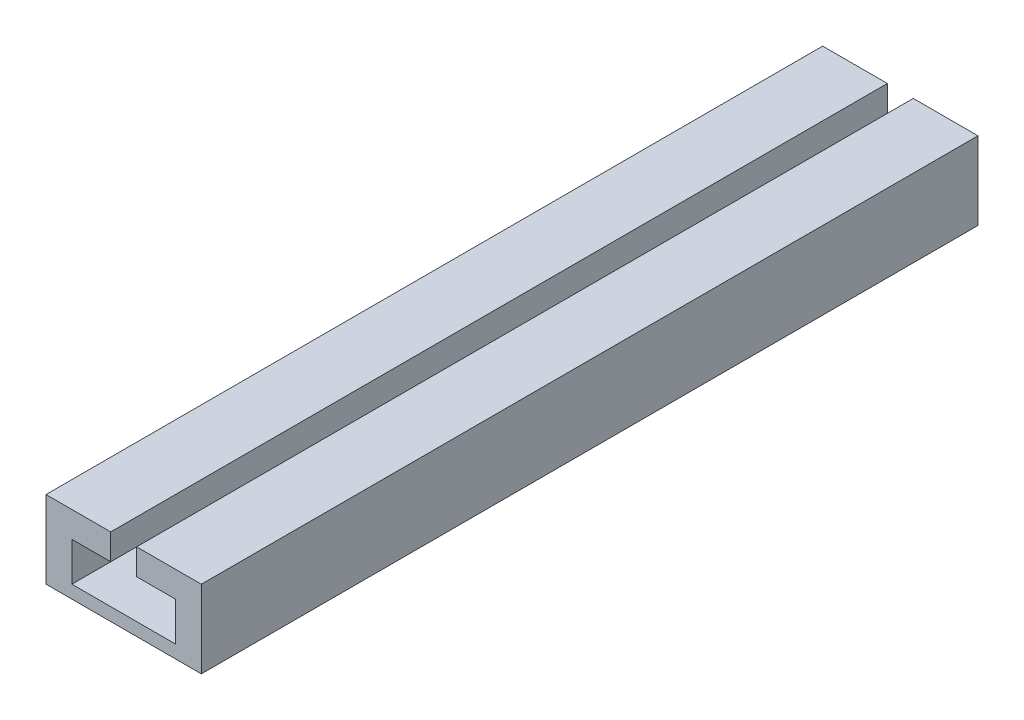
ISO-10303-21;
HEADER;
FILE_DESCRIPTION(('STEP AP214'),'2;1');
FILE_NAME('part.step','',(''),(''),'','','');
FILE_SCHEMA(('AUTOMOTIVE_DESIGN { 1 0 10303 214 1 1 1 1 }'));
ENDSEC;
DATA;
#1=APPLICATION_CONTEXT('core data for automotive mechanical design processes');
#2=APPLICATION_PROTOCOL_DEFINITION('international standard','automotive_design',2000,#1);
#3=PRODUCT_CONTEXT('',#1,'mechanical');
#4=PRODUCT('Part','Part','',(#3));
#5=PRODUCT_RELATED_PRODUCT_CATEGORY('part','',(#4));
#6=PRODUCT_DEFINITION_FORMATION('','',#4);
#7=PRODUCT_DEFINITION_CONTEXT('part definition',#1,'design');
#8=PRODUCT_DEFINITION('design','',#6,#7);
#9=PRODUCT_DEFINITION_SHAPE('','',#8);
#10=(LENGTH_UNIT() NAMED_UNIT(*) SI_UNIT(.MILLI.,.METRE.));
#11=(NAMED_UNIT(*) PLANE_ANGLE_UNIT() SI_UNIT($,.RADIAN.));
#12=(NAMED_UNIT(*) SI_UNIT($,.STERADIAN.) SOLID_ANGLE_UNIT());
#13=UNCERTAINTY_MEASURE_WITH_UNIT(LENGTH_MEASURE(1.E-05),#10,'distance_accuracy_value','');
#14=(GEOMETRIC_REPRESENTATION_CONTEXT(3) GLOBAL_UNCERTAINTY_ASSIGNED_CONTEXT((#13)) GLOBAL_UNIT_ASSIGNED_CONTEXT((#10,
#11,#12)) REPRESENTATION_CONTEXT('',''));
#15=CARTESIAN_POINT('',(0.,0.,0.));
#16=DIRECTION('',(0.,0.,1.));
#17=DIRECTION('',(1.,0.,0.));
#18=AXIS2_PLACEMENT_3D('',#15,#16,#17);
#19=CARTESIAN_POINT('',(0.,0.,30.));
#20=DIRECTION('',(0.,0.,1.));
#21=DIRECTION('',(1.,0.,0.));
#22=AXIS2_PLACEMENT_3D('',#19,#20,#21);
#23=PLANE('',#22);
#24=DIRECTION('',(0.,-1.,0.));
#25=VECTOR('',#24,1.);
#26=CARTESIAN_POINT('',(0.499999999999999,1.5,30.));
#27=LINE('',#26,#25);
#28=CARTESIAN_POINT('',(0.499999999999999,1.5,30.));
#29=VERTEX_POINT('',#28);
#30=CARTESIAN_POINT('',(0.499999999999999,0.5,30.));
#31=VERTEX_POINT('',#30);
#32=EDGE_CURVE('E170',#29,#31,#27,.T.);
#33=ORIENTED_EDGE('',*,*,#32,.T.);
#34=DIRECTION('',(-1.,0.,0.));
#35=VECTOR('',#34,1.);
#36=CARTESIAN_POINT('',(2.,0.5,30.));
#37=LINE('',#36,#35);
#38=CARTESIAN_POINT('',(2.,0.5,30.));
#39=VERTEX_POINT('',#38);
#40=EDGE_CURVE('E47',#39,#31,#37,.T.);
#41=ORIENTED_EDGE('',*,*,#40,.F.);
#42=DIRECTION('',(0.,-1.,0.));
#43=VECTOR('',#42,1.);
#44=CARTESIAN_POINT('',(2.,0.5,30.));
#45=LINE('',#44,#43);
#46=CARTESIAN_POINT('',(2.,-1.,30.));
#47=VERTEX_POINT('',#46);
#48=EDGE_CURVE('E126',#39,#47,#45,.T.);
#49=ORIENTED_EDGE('',*,*,#48,.T.);
#50=DIRECTION('',(-1.,0.,0.));
#51=VECTOR('',#50,1.);
#52=CARTESIAN_POINT('',(2.,-1.,30.));
#53=LINE('',#52,#51);
#54=CARTESIAN_POINT('',(-2.,-1.,30.));
#55=VERTEX_POINT('',#54);
#56=EDGE_CURVE('E136',#47,#55,#53,.T.);
#57=ORIENTED_EDGE('',*,*,#56,.T.);
#58=DIRECTION('',(0.,-1.,0.));
#59=VECTOR('',#58,1.);
#60=CARTESIAN_POINT('',(-2.,0.5,30.));
#61=LINE('',#60,#59);
#62=CARTESIAN_POINT('',(-2.,0.5,30.));
#63=VERTEX_POINT('',#62);
#64=EDGE_CURVE('E140',#63,#55,#61,.T.);
#65=ORIENTED_EDGE('',*,*,#64,.F.);
#66=CARTESIAN_POINT('',(-0.500000000000001,0.5,30.));
#67=VERTEX_POINT('',#66);
#68=EDGE_CURVE('E150',#67,#63,#37,.T.);
#69=ORIENTED_EDGE('',*,*,#68,.F.);
#70=DIRECTION('',(0.,-1.,0.));
#71=VECTOR('',#70,1.);
#72=CARTESIAN_POINT('',(-0.500000000000001,1.5,30.));
#73=LINE('',#72,#71);
#74=CARTESIAN_POINT('',(-0.500000000000001,1.5,30.));
#75=VERTEX_POINT('',#74);
#76=EDGE_CURVE('E167',#75,#67,#73,.T.);
#77=ORIENTED_EDGE('',*,*,#76,.F.);
#78=DIRECTION('',(1.,0.,0.));
#79=VECTOR('',#78,1.);
#80=CARTESIAN_POINT('',(-3.,1.5,30.));
#81=LINE('',#80,#79);
#82=CARTESIAN_POINT('',(-3.,1.5,30.));
#83=VERTEX_POINT('',#82);
#84=EDGE_CURVE('E191',#83,#75,#81,.T.);
#85=ORIENTED_EDGE('',*,*,#84,.F.);
#86=DIRECTION('',(0.,-1.,0.));
#87=VECTOR('',#86,1.);
#88=CARTESIAN_POINT('',(-3.,1.5,30.));
#89=LINE('',#88,#87);
#90=CARTESIAN_POINT('',(-3.,-1.5,30.));
#91=VERTEX_POINT('',#90);
#92=EDGE_CURVE('E181',#83,#91,#89,.T.);
#93=ORIENTED_EDGE('',*,*,#92,.T.);
#94=DIRECTION('',(1.,0.,0.));
#95=VECTOR('',#94,1.);
#96=CARTESIAN_POINT('',(-3.,-1.5,30.));
#97=LINE('',#96,#95);
#98=CARTESIAN_POINT('',(3.,-1.5,30.));
#99=VERTEX_POINT('',#98);
#100=EDGE_CURVE('E184',#91,#99,#97,.T.);
#101=ORIENTED_EDGE('',*,*,#100,.T.);
#102=DIRECTION('',(0.,-1.,0.));
#103=VECTOR('',#102,1.);
#104=CARTESIAN_POINT('',(3.,1.5,30.));
#105=LINE('',#104,#103);
#106=CARTESIAN_POINT('',(3.,1.5,30.));
#107=VERTEX_POINT('',#106);
#108=EDGE_CURVE('E187',#107,#99,#105,.T.);
#109=ORIENTED_EDGE('',*,*,#108,.F.);
#110=EDGE_CURVE('E190',#29,#107,#81,.T.);
#111=ORIENTED_EDGE('',*,*,#110,.F.);
#112=EDGE_LOOP('',(#33,#41,#49,#57,#65,#69,#77,#85,#93,#101,#109,#111));
#113=FACE_BOUND('',#112,.T.);
#114=ADVANCED_FACE('F33',(#113),#23,.T.);
#115=CARTESIAN_POINT('',(0.,0.,0.));
#116=DIRECTION('',(0.,0.,1.));
#117=DIRECTION('',(1.,0.,0.));
#118=AXIS2_PLACEMENT_3D('',#115,#116,#117);
#119=PLANE('',#118);
#120=DIRECTION('',(-1.,0.,0.));
#121=VECTOR('',#120,1.);
#122=CARTESIAN_POINT('',(2.,0.5,0.));
#123=LINE('',#122,#121);
#124=CARTESIAN_POINT('',(2.,0.5,0.));
#125=VERTEX_POINT('',#124);
#126=CARTESIAN_POINT('',(0.499999999999999,0.5,0.));
#127=VERTEX_POINT('',#126);
#128=EDGE_CURVE('E143',#125,#127,#123,.T.);
#129=ORIENTED_EDGE('',*,*,#128,.T.);
#130=DIRECTION('',(0.,-1.,0.));
#131=VECTOR('',#130,1.);
#132=CARTESIAN_POINT('',(0.499999999999999,1.5,0.));
#133=LINE('',#132,#131);
#134=CARTESIAN_POINT('',(0.499999999999999,1.5,0.));
#135=VERTEX_POINT('',#134);
#136=EDGE_CURVE('E171',#135,#127,#133,.T.);
#137=ORIENTED_EDGE('',*,*,#136,.F.);
#138=DIRECTION('',(1.,0.,0.));
#139=VECTOR('',#138,1.);
#140=CARTESIAN_POINT('',(-3.,1.5,0.));
#141=LINE('',#140,#139);
#142=CARTESIAN_POINT('',(3.,1.5,0.));
#143=VERTEX_POINT('',#142);
#144=EDGE_CURVE('E203',#135,#143,#141,.T.);
#145=ORIENTED_EDGE('',*,*,#144,.T.);
#146=DIRECTION('',(0.,-1.,0.));
#147=VECTOR('',#146,1.);
#148=CARTESIAN_POINT('',(3.,1.5,0.));
#149=LINE('',#148,#147);
#150=CARTESIAN_POINT('',(3.,-1.5,0.));
#151=VERTEX_POINT('',#150);
#152=EDGE_CURVE('E200',#143,#151,#149,.T.);
#153=ORIENTED_EDGE('',*,*,#152,.T.);
#154=DIRECTION('',(1.,0.,0.));
#155=VECTOR('',#154,1.);
#156=CARTESIAN_POINT('',(-3.,-1.5,0.));
#157=LINE('',#156,#155);
#158=CARTESIAN_POINT('',(-3.,-1.5,0.));
#159=VERTEX_POINT('',#158);
#160=EDGE_CURVE('E197',#159,#151,#157,.T.);
#161=ORIENTED_EDGE('',*,*,#160,.F.);
#162=DIRECTION('',(0.,-1.,0.));
#163=VECTOR('',#162,1.);
#164=CARTESIAN_POINT('',(-3.,1.5,0.));
#165=LINE('',#164,#163);
#166=CARTESIAN_POINT('',(-3.,1.5,0.));
#167=VERTEX_POINT('',#166);
#168=EDGE_CURVE('E180',#167,#159,#165,.T.);
#169=ORIENTED_EDGE('',*,*,#168,.F.);
#170=CARTESIAN_POINT('',(-0.500000000000001,1.5,0.));
#171=VERTEX_POINT('',#170);
#172=EDGE_CURVE('E185',#167,#171,#141,.T.);
#173=ORIENTED_EDGE('',*,*,#172,.T.);
#174=DIRECTION('',(0.,-1.,0.));
#175=VECTOR('',#174,1.);
#176=CARTESIAN_POINT('',(-0.500000000000001,1.5,0.));
#177=LINE('',#176,#175);
#178=CARTESIAN_POINT('',(-0.500000000000001,0.5,0.));
#179=VERTEX_POINT('',#178);
#180=EDGE_CURVE('E166',#171,#179,#177,.T.);
#181=ORIENTED_EDGE('',*,*,#180,.T.);
#182=CARTESIAN_POINT('',(-2.,0.5,0.));
#183=VERTEX_POINT('',#182);
#184=EDGE_CURVE('E146',#179,#183,#123,.T.);
#185=ORIENTED_EDGE('',*,*,#184,.T.);
#186=DIRECTION('',(0.,-1.,0.));
#187=VECTOR('',#186,1.);
#188=CARTESIAN_POINT('',(-2.,0.5,0.));
#189=LINE('',#188,#187);
#190=CARTESIAN_POINT('',(-2.,-1.,0.));
#191=VERTEX_POINT('',#190);
#192=EDGE_CURVE('E155',#183,#191,#189,.T.);
#193=ORIENTED_EDGE('',*,*,#192,.T.);
#194=DIRECTION('',(-1.,0.,0.));
#195=VECTOR('',#194,1.);
#196=CARTESIAN_POINT('',(2.,-1.,0.));
#197=LINE('',#196,#195);
#198=CARTESIAN_POINT('',(2.,-1.,0.));
#199=VERTEX_POINT('',#198);
#200=EDGE_CURVE('E153',#199,#191,#197,.T.);
#201=ORIENTED_EDGE('',*,*,#200,.F.);
#202=DIRECTION('',(0.,-1.,0.));
#203=VECTOR('',#202,1.);
#204=CARTESIAN_POINT('',(2.,0.5,0.));
#205=LINE('',#204,#203);
#206=EDGE_CURVE('E128',#125,#199,#205,.T.);
#207=ORIENTED_EDGE('',*,*,#206,.F.);
#208=EDGE_LOOP('',(#129,#137,#145,#153,#161,#169,#173,#181,#185,#193,#201,#207));
#209=FACE_BOUND('',#208,.T.);
#210=ADVANCED_FACE('F221',(#209),#119,.F.);
#211=CARTESIAN_POINT('',(-0.500000000000001,1.5,30.));
#212=DIRECTION('',(1.,0.,0.));
#213=DIRECTION('',(0.,1.,0.));
#214=AXIS2_PLACEMENT_3D('',#211,#212,#213);
#215=PLANE('',#214);
#216=ORIENTED_EDGE('',*,*,#76,.T.);
#217=DIRECTION('',(0.,0.,-1.));
#218=VECTOR('',#217,1.);
#219=CARTESIAN_POINT('',(-0.500000000000001,0.5,30.));
#220=LINE('',#219,#218);
#221=EDGE_CURVE('E160',#67,#179,#220,.T.);
#222=ORIENTED_EDGE('',*,*,#221,.T.);
#223=ORIENTED_EDGE('',*,*,#180,.F.);
#224=DIRECTION('',(0.,0.,-1.));
#225=VECTOR('',#224,1.);
#226=CARTESIAN_POINT('',(-0.500000000000001,1.5,30.));
#227=LINE('',#226,#225);
#228=EDGE_CURVE('E177',#75,#171,#227,.T.);
#229=ORIENTED_EDGE('',*,*,#228,.F.);
#230=EDGE_LOOP('',(#216,#222,#223,#229));
#231=FACE_BOUND('',#230,.T.);
#232=ADVANCED_FACE('F227',(#231),#215,.T.);
#233=CARTESIAN_POINT('',(0.499999999999999,1.5,30.));
#234=DIRECTION('',(1.,0.,0.));
#235=DIRECTION('',(0.,1.,0.));
#236=AXIS2_PLACEMENT_3D('',#233,#234,#235);
#237=PLANE('',#236);
#238=DIRECTION('',(0.,0.,-1.));
#239=VECTOR('',#238,1.);
#240=CARTESIAN_POINT('',(0.499999999999999,0.5,30.));
#241=LINE('',#240,#239);
#242=EDGE_CURVE('E11',#31,#127,#241,.T.);
#243=ORIENTED_EDGE('',*,*,#242,.F.);
#244=ORIENTED_EDGE('',*,*,#32,.F.);
#245=DIRECTION('',(0.,0.,-1.));
#246=VECTOR('',#245,1.);
#247=CARTESIAN_POINT('',(0.499999999999999,1.5,30.));
#248=LINE('',#247,#246);
#249=EDGE_CURVE('E55',#29,#135,#248,.T.);
#250=ORIENTED_EDGE('',*,*,#249,.T.);
#251=ORIENTED_EDGE('',*,*,#136,.T.);
#252=EDGE_LOOP('',(#243,#244,#250,#251));
#253=FACE_BOUND('',#252,.T.);
#254=ADVANCED_FACE('F238',(#253),#237,.F.);
#255=CARTESIAN_POINT('',(-3.,1.5,30.));
#256=DIRECTION('',(0.,1.,0.));
#257=DIRECTION('',(0.,0.,1.));
#258=AXIS2_PLACEMENT_3D('',#255,#256,#257);
#259=PLANE('',#258);
#260=ORIENTED_EDGE('',*,*,#84,.T.);
#261=ORIENTED_EDGE('',*,*,#228,.T.);
#262=ORIENTED_EDGE('',*,*,#172,.F.);
#263=DIRECTION('',(0.,0.,-1.));
#264=VECTOR('',#263,1.);
#265=CARTESIAN_POINT('',(-3.,1.5,30.));
#266=LINE('',#265,#264);
#267=EDGE_CURVE('E194',#83,#167,#266,.T.);
#268=ORIENTED_EDGE('',*,*,#267,.F.);
#269=EDGE_LOOP('',(#260,#261,#262,#268));
#270=FACE_BOUND('',#269,.T.);
#271=ADVANCED_FACE('F223',(#270),#259,.T.);
#272=CARTESIAN_POINT('',(-3.,1.5,30.));
#273=DIRECTION('',(1.,0.,0.));
#274=DIRECTION('',(0.,1.,0.));
#275=AXIS2_PLACEMENT_3D('',#272,#273,#274);
#276=PLANE('',#275);
#277=ORIENTED_EDGE('',*,*,#168,.T.);
#278=DIRECTION('',(0.,0.,-1.));
#279=VECTOR('',#278,1.);
#280=CARTESIAN_POINT('',(-3.,-1.5,30.));
#281=LINE('',#280,#279);
#282=EDGE_CURVE('E41',#91,#159,#281,.T.);
#283=ORIENTED_EDGE('',*,*,#282,.F.);
#284=ORIENTED_EDGE('',*,*,#92,.F.);
#285=ORIENTED_EDGE('',*,*,#267,.T.);
#286=EDGE_LOOP('',(#277,#283,#284,#285));
#287=FACE_BOUND('',#286,.T.);
#288=ADVANCED_FACE('F35',(#287),#276,.F.);
#289=CARTESIAN_POINT('',(-3.,-1.5,30.));
#290=DIRECTION('',(0.,1.,0.));
#291=DIRECTION('',(0.,0.,1.));
#292=AXIS2_PLACEMENT_3D('',#289,#290,#291);
#293=PLANE('',#292);
#294=ORIENTED_EDGE('',*,*,#160,.T.);
#295=DIRECTION('',(0.,0.,-1.));
#296=VECTOR('',#295,1.);
#297=CARTESIAN_POINT('',(3.,-1.5,30.));
#298=LINE('',#297,#296);
#299=EDGE_CURVE('E210',#99,#151,#298,.T.);
#300=ORIENTED_EDGE('',*,*,#299,.F.);
#301=ORIENTED_EDGE('',*,*,#100,.F.);
#302=ORIENTED_EDGE('',*,*,#282,.T.);
#303=EDGE_LOOP('',(#294,#300,#301,#302));
#304=FACE_BOUND('',#303,.T.);
#305=ADVANCED_FACE('F214',(#304),#293,.F.);
#306=CARTESIAN_POINT('',(3.,1.5,30.));
#307=DIRECTION('',(1.,0.,0.));
#308=DIRECTION('',(0.,1.,0.));
#309=AXIS2_PLACEMENT_3D('',#306,#307,#308);
#310=PLANE('',#309);
#311=ORIENTED_EDGE('',*,*,#152,.F.);
#312=DIRECTION('',(0.,0.,-1.));
#313=VECTOR('',#312,1.);
#314=CARTESIAN_POINT('',(3.,1.5,30.));
#315=LINE('',#314,#313);
#316=EDGE_CURVE('E207',#107,#143,#315,.T.);
#317=ORIENTED_EDGE('',*,*,#316,.F.);
#318=ORIENTED_EDGE('',*,*,#108,.T.);
#319=ORIENTED_EDGE('',*,*,#299,.T.);
#320=EDGE_LOOP('',(#311,#317,#318,#319));
#321=FACE_BOUND('',#320,.T.);
#322=ADVANCED_FACE('F246',(#321),#310,.T.);
#323=ORIENTED_EDGE('',*,*,#249,.F.);
#324=ORIENTED_EDGE('',*,*,#110,.T.);
#325=ORIENTED_EDGE('',*,*,#316,.T.);
#326=ORIENTED_EDGE('',*,*,#144,.F.);
#327=EDGE_LOOP('',(#323,#324,#325,#326));
#328=FACE_BOUND('',#327,.T.);
#329=ADVANCED_FACE('F243',(#328),#259,.T.);
#330=CARTESIAN_POINT('',(2.,0.5,30.));
#331=DIRECTION('',(0.,-1.,0.));
#332=DIRECTION('',(0.,0.,-1.));
#333=AXIS2_PLACEMENT_3D('',#330,#331,#332);
#334=PLANE('',#333);
#335=ORIENTED_EDGE('',*,*,#242,.T.);
#336=ORIENTED_EDGE('',*,*,#128,.F.);
#337=DIRECTION('',(0.,0.,-1.));
#338=VECTOR('',#337,1.);
#339=CARTESIAN_POINT('',(2.,0.5,30.));
#340=LINE('',#339,#338);
#341=EDGE_CURVE('E158',#39,#125,#340,.T.);
#342=ORIENTED_EDGE('',*,*,#341,.F.);
#343=ORIENTED_EDGE('',*,*,#40,.T.);
#344=EDGE_LOOP('',(#335,#336,#342,#343));
#345=FACE_BOUND('',#344,.T.);
#346=ADVANCED_FACE('F253',(#345),#334,.T.);
#347=CARTESIAN_POINT('',(2.,0.5,30.));
#348=DIRECTION('',(1.,0.,0.));
#349=DIRECTION('',(0.,0.,-1.));
#350=AXIS2_PLACEMENT_3D('',#347,#348,#349);
#351=PLANE('',#350);
#352=ORIENTED_EDGE('',*,*,#206,.T.);
#353=DIRECTION('',(0.,0.,-1.));
#354=VECTOR('',#353,1.);
#355=CARTESIAN_POINT('',(2.,-1.,30.));
#356=LINE('',#355,#354);
#357=EDGE_CURVE('E122',#47,#199,#356,.T.);
#358=ORIENTED_EDGE('',*,*,#357,.F.);
#359=ORIENTED_EDGE('',*,*,#48,.F.);
#360=ORIENTED_EDGE('',*,*,#341,.T.);
#361=EDGE_LOOP('',(#352,#358,#359,#360));
#362=FACE_BOUND('',#361,.T.);
#363=ADVANCED_FACE('F124',(#362),#351,.F.);
#364=ORIENTED_EDGE('',*,*,#68,.T.);
#365=DIRECTION('',(0.,0.,-1.));
#366=VECTOR('',#365,1.);
#367=CARTESIAN_POINT('',(-2.,0.5,30.));
#368=LINE('',#367,#366);
#369=EDGE_CURVE('E161',#63,#183,#368,.T.);
#370=ORIENTED_EDGE('',*,*,#369,.T.);
#371=ORIENTED_EDGE('',*,*,#184,.F.);
#372=ORIENTED_EDGE('',*,*,#221,.F.);
#373=EDGE_LOOP('',(#364,#370,#371,#372));
#374=FACE_BOUND('',#373,.T.);
#375=ADVANCED_FACE('F231',(#374),#334,.T.);
#376=CARTESIAN_POINT('',(-2.,0.5,30.));
#377=DIRECTION('',(1.,0.,0.));
#378=DIRECTION('',(0.,0.,-1.));
#379=AXIS2_PLACEMENT_3D('',#376,#377,#378);
#380=PLANE('',#379);
#381=ORIENTED_EDGE('',*,*,#192,.F.);
#382=ORIENTED_EDGE('',*,*,#369,.F.);
#383=ORIENTED_EDGE('',*,*,#64,.T.);
#384=DIRECTION('',(0.,0.,-1.));
#385=VECTOR('',#384,1.);
#386=CARTESIAN_POINT('',(-2.,-1.,30.));
#387=LINE('',#386,#385);
#388=EDGE_CURVE('E132',#55,#191,#387,.T.);
#389=ORIENTED_EDGE('',*,*,#388,.T.);
#390=EDGE_LOOP('',(#381,#382,#383,#389));
#391=FACE_BOUND('',#390,.T.);
#392=ADVANCED_FACE('F234',(#391),#380,.T.);
#393=CARTESIAN_POINT('',(2.,-1.,30.));
#394=DIRECTION('',(0.,-1.,0.));
#395=DIRECTION('',(0.,0.,-1.));
#396=AXIS2_PLACEMENT_3D('',#393,#394,#395);
#397=PLANE('',#396);
#398=ORIENTED_EDGE('',*,*,#200,.T.);
#399=ORIENTED_EDGE('',*,*,#388,.F.);
#400=ORIENTED_EDGE('',*,*,#56,.F.);
#401=ORIENTED_EDGE('',*,*,#357,.T.);
#402=EDGE_LOOP('',(#398,#399,#400,#401));
#403=FACE_BOUND('',#402,.T.);
#404=ADVANCED_FACE('F137',(#403),#397,.F.);
#405=CLOSED_SHELL('',(#114,#210,#232,#254,#271,#288,#305,#322,#329,#346,#363,#375,#392,#404));
#406=MANIFOLD_SOLID_BREP('B2',#405);
#407=ADVANCED_BREP_SHAPE_REPRESENTATION('',(#18,#406),#14);
#408=SHAPE_DEFINITION_REPRESENTATION(#9,#407);
ENDSEC;
END-ISO-10303-21;
